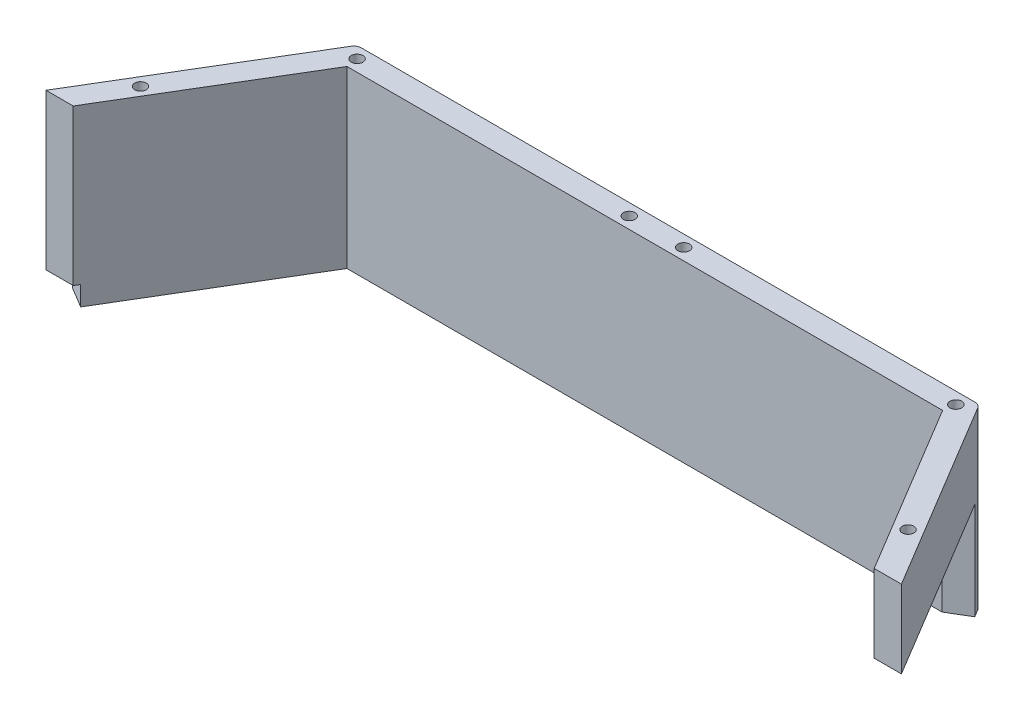
ISO-10303-21;
HEADER;
FILE_DESCRIPTION(('STEP AP214'),'2;1');
FILE_NAME('part.step','',(''),(''),'','','');
FILE_SCHEMA(('AUTOMOTIVE_DESIGN { 1 0 10303 214 1 1 1 1 }'));
ENDSEC;
DATA;
#1=APPLICATION_CONTEXT('core data for automotive mechanical design processes');
#2=APPLICATION_PROTOCOL_DEFINITION('international standard','automotive_design',2000,#1);
#3=PRODUCT_CONTEXT('',#1,'mechanical');
#4=PRODUCT('Part','Part','',(#3));
#5=PRODUCT_RELATED_PRODUCT_CATEGORY('part','',(#4));
#6=PRODUCT_DEFINITION_FORMATION('','',#4);
#7=PRODUCT_DEFINITION_CONTEXT('part definition',#1,'design');
#8=PRODUCT_DEFINITION('design','',#6,#7);
#9=PRODUCT_DEFINITION_SHAPE('','',#8);
#10=(LENGTH_UNIT() NAMED_UNIT(*) SI_UNIT(.MILLI.,.METRE.));
#11=(NAMED_UNIT(*) PLANE_ANGLE_UNIT() SI_UNIT($,.RADIAN.));
#12=(NAMED_UNIT(*) SI_UNIT($,.STERADIAN.) SOLID_ANGLE_UNIT());
#13=UNCERTAINTY_MEASURE_WITH_UNIT(LENGTH_MEASURE(1.E-05),#10,'distance_accuracy_value','');
#14=(GEOMETRIC_REPRESENTATION_CONTEXT(3) GLOBAL_UNCERTAINTY_ASSIGNED_CONTEXT((#13)) GLOBAL_UNIT_ASSIGNED_CONTEXT((#10,
#11,#12)) REPRESENTATION_CONTEXT('',''));
#15=CARTESIAN_POINT('',(0.,0.,0.));
#16=DIRECTION('',(0.,0.,1.));
#17=DIRECTION('',(1.,0.,0.));
#18=AXIS2_PLACEMENT_3D('',#15,#16,#17);
#19=CARTESIAN_POINT('',(-76.6,22.5,-43.9999999999998));
#20=DIRECTION('',(-0.857492925712545,0.,-0.514495755427526));
#21=DIRECTION('',(-0.514495755427526,0.,0.857492925712545));
#22=AXIS2_PLACEMENT_3D('',#19,#20,#21);
#23=PLANE('',#22);
#24=DIRECTION('',(0.,1.,0.));
#25=VECTOR('',#24,1.);
#26=CARTESIAN_POINT('',(-102.280462399333,-17.5,-1.19922933444495));
#27=LINE('',#26,#25);
#28=CARTESIAN_POINT('',(-102.280462399333,-22.5,-1.19922933444495));
#29=VERTEX_POINT('',#28);
#30=CARTESIAN_POINT('',(-102.280462399333,-17.5,-1.19922933444495));
#31=VERTEX_POINT('',#30);
#32=EDGE_CURVE('E140',#29,#31,#27,.T.);
#33=ORIENTED_EDGE('',*,*,#32,.F.);
#34=DIRECTION('',(0.514495755427526,0.,-0.857492925712545));
#35=VECTOR('',#34,1.);
#36=CARTESIAN_POINT('',(-76.6,-22.5,-43.9999999999998));
#37=LINE('',#36,#35);
#38=CARTESIAN_POINT('',(-76.6,-22.5,-43.9999999999998));
#39=VERTEX_POINT('',#38);
#40=EDGE_CURVE('E155',#29,#39,#37,.T.);
#41=ORIENTED_EDGE('',*,*,#40,.T.);
#42=DIRECTION('',(0.,-1.,0.));
#43=VECTOR('',#42,1.);
#44=CARTESIAN_POINT('',(-76.6,22.5,-43.9999999999998));
#45=LINE('',#44,#43);
#46=CARTESIAN_POINT('',(-76.6,22.5,-43.9999999999998));
#47=VERTEX_POINT('',#46);
#48=EDGE_CURVE('E195',#47,#39,#45,.T.);
#49=ORIENTED_EDGE('',*,*,#48,.F.);
#50=DIRECTION('',(0.514495755427526,0.,-0.857492925712545));
#51=VECTOR('',#50,1.);
#52=CARTESIAN_POINT('',(-76.6,22.5,-43.9999999999998));
#53=LINE('',#52,#51);
#54=CARTESIAN_POINT('',(-103.,22.5,1.75709577940571E-13));
#55=VERTEX_POINT('',#54);
#56=EDGE_CURVE('E269',#55,#47,#53,.T.);
#57=ORIENTED_EDGE('',*,*,#56,.F.);
#58=DIRECTION('',(0.,-1.,0.));
#59=VECTOR('',#58,1.);
#60=CARTESIAN_POINT('',(-103.,22.5,1.75709577940571E-13));
#61=LINE('',#60,#59);
#62=CARTESIAN_POINT('',(-103.,-17.5,1.75458324507114E-13));
#63=VERTEX_POINT('',#62);
#64=EDGE_CURVE('E191',#55,#63,#61,.T.);
#65=ORIENTED_EDGE('',*,*,#64,.T.);
#66=DIRECTION('',(-0.514495755427527,0.,0.857492925712544));
#67=VECTOR('',#66,1.);
#68=CARTESIAN_POINT('',(-104.852941176471,-17.5,3.08823529411777));
#69=LINE('',#68,#67);
#70=EDGE_CURVE('E153',#31,#63,#69,.T.);
#71=ORIENTED_EDGE('',*,*,#70,.F.);
#72=EDGE_LOOP('',(#33,#41,#49,#57,#65,#71));
#73=FACE_BOUND('',#72,.T.);
#74=ADVANCED_FACE('F39',(#73),#23,.F.);
#75=CARTESIAN_POINT('',(110.,22.5,1.76566830699974E-13));
#76=DIRECTION('',(-0.857492925712544,0.,0.514495755427526));
#77=DIRECTION('',(0.514495755427526,0.,0.857492925712544));
#78=AXIS2_PLACEMENT_3D('',#75,#76,#77);
#79=PLANE('',#78);
#80=DIRECTION('',(0.,1.,0.));
#81=VECTOR('',#80,1.);
#82=CARTESIAN_POINT('',(81.7027334514861,2.5,-47.1621109141898));
#83=LINE('',#82,#81);
#84=CARTESIAN_POINT('',(81.7027334514861,-22.5,-47.1621109141898));
#85=VERTEX_POINT('',#84);
#86=CARTESIAN_POINT('',(81.7027334514861,2.5,-47.1621109141898));
#87=VERTEX_POINT('',#86);
#88=EDGE_CURVE('E316',#85,#87,#83,.T.);
#89=ORIENTED_EDGE('',*,*,#88,.F.);
#90=DIRECTION('',(-0.514495755427526,0.,-0.857492925712544));
#91=VECTOR('',#90,1.);
#92=CARTESIAN_POINT('',(110.,-22.5,1.76566830699974E-13));
#93=LINE('',#92,#91);
#94=CARTESIAN_POINT('',(80.582605093487,-22.5,-49.0289915108549));
#95=VERTEX_POINT('',#94);
#96=EDGE_CURVE('E165',#85,#95,#93,.T.);
#97=ORIENTED_EDGE('',*,*,#96,.T.);
#98=DIRECTION('',(0.,-1.,0.));
#99=VECTOR('',#98,1.);
#100=CARTESIAN_POINT('',(80.582605093487,22.5,-49.0289915108549));
#101=LINE('',#100,#99);
#102=CARTESIAN_POINT('',(80.582605093487,22.5,-49.0289915108549));
#103=VERTEX_POINT('',#102);
#104=EDGE_CURVE('E207',#95,#103,#101,.F.);
#105=ORIENTED_EDGE('',*,*,#104,.T.);
#106=DIRECTION('',(-0.514495755427526,0.,-0.857492925712544));
#107=VECTOR('',#106,1.);
#108=CARTESIAN_POINT('',(110.,22.5,1.76566830699974E-13));
#109=LINE('',#108,#107);
#110=CARTESIAN_POINT('',(110.,22.5,1.76566830699974E-13));
#111=VERTEX_POINT('',#110);
#112=EDGE_CURVE('E277',#111,#103,#109,.T.);
#113=ORIENTED_EDGE('',*,*,#112,.F.);
#114=DIRECTION('',(0.,-1.,0.));
#115=VECTOR('',#114,1.);
#116=CARTESIAN_POINT('',(110.,22.5,1.76566830699974E-13));
#117=LINE('',#116,#115);
#118=CARTESIAN_POINT('',(110.,2.50000000000001,1.76566830699974E-13));
#119=VERTEX_POINT('',#118);
#120=EDGE_CURVE('E182',#111,#119,#117,.T.);
#121=ORIENTED_EDGE('',*,*,#120,.T.);
#122=DIRECTION('',(0.514495755427527,0.,0.857492925712544));
#123=VECTOR('',#122,1.);
#124=CARTESIAN_POINT('',(110.,2.5,1.73472347597681E-13));
#125=LINE('',#124,#123);
#126=EDGE_CURVE('E65',#87,#119,#125,.T.);
#127=ORIENTED_EDGE('',*,*,#126,.F.);
#128=EDGE_LOOP('',(#89,#97,#105,#113,#121,#127));
#129=FACE_BOUND('',#128,.T.);
#130=ADVANCED_FACE('F327',(#129),#79,.F.);
#131=CARTESIAN_POINT('',(-103.,22.5,1.75709577940571E-13));
#132=DIRECTION('',(0.,0.,-1.));
#133=DIRECTION('',(-1.,0.,0.));
#134=AXIS2_PLACEMENT_3D('',#131,#132,#133);
#135=PLANE('',#134);
#136=DIRECTION('',(0.,-1.,0.));
#137=VECTOR('',#136,1.);
#138=CARTESIAN_POINT('',(-110.,22.5,1.76566830699974E-13));
#139=LINE('',#138,#137);
#140=CARTESIAN_POINT('',(-110.,22.5,1.76566830699974E-13));
#141=VERTEX_POINT('',#140);
#142=CARTESIAN_POINT('',(-110.,-17.5,1.73129347676788E-13));
#143=VERTEX_POINT('',#142);
#144=EDGE_CURVE('E179',#141,#143,#139,.T.);
#145=ORIENTED_EDGE('',*,*,#144,.T.);
#146=DIRECTION('',(1.,0.,0.));
#147=VECTOR('',#146,1.);
#148=CARTESIAN_POINT('',(-103.,-17.5,1.75709577940571E-13));
#149=LINE('',#148,#147);
#150=EDGE_CURVE('E295',#143,#63,#149,.T.);
#151=ORIENTED_EDGE('',*,*,#150,.T.);
#152=ORIENTED_EDGE('',*,*,#64,.F.);
#153=DIRECTION('',(1.,0.,0.));
#154=VECTOR('',#153,1.);
#155=CARTESIAN_POINT('',(-103.,22.5,1.75709577940571E-13));
#156=LINE('',#155,#154);
#157=EDGE_CURVE('E177',#141,#55,#156,.T.);
#158=ORIENTED_EDGE('',*,*,#157,.F.);
#159=EDGE_LOOP('',(#145,#151,#152,#158));
#160=FACE_BOUND('',#159,.T.);
#161=ADVANCED_FACE('F291',(#160),#135,.F.);
#162=CARTESIAN_POINT('',(76.6,22.5,-43.9999999999998));
#163=DIRECTION('',(0.,0.,-1.));
#164=DIRECTION('',(-1.,0.,0.));
#165=AXIS2_PLACEMENT_3D('',#162,#163,#164);
#166=PLANE('',#165);
#167=DIRECTION('',(0.,1.,0.));
#168=VECTOR('',#167,1.);
#169=CARTESIAN_POINT('',(76.4325485945028,22.5,-43.9999999999998));
#170=LINE('',#169,#168);
#171=CARTESIAN_POINT('',(76.4325485945028,-22.5,-43.9999999999998));
#172=VERTEX_POINT('',#171);
#173=CARTESIAN_POINT('',(76.4325485945028,2.5,-43.9999999999998));
#174=VERTEX_POINT('',#173);
#175=EDGE_CURVE('E225',#172,#174,#170,.T.);
#176=ORIENTED_EDGE('',*,*,#175,.T.);
#177=DIRECTION('',(1.,0.,0.));
#178=VECTOR('',#177,1.);
#179=CARTESIAN_POINT('',(76.6,2.5,-43.9999999999998));
#180=LINE('',#179,#178);
#181=CARTESIAN_POINT('',(76.6,2.5,-43.9999999999998));
#182=VERTEX_POINT('',#181);
#183=EDGE_CURVE('E233',#174,#182,#180,.T.);
#184=ORIENTED_EDGE('',*,*,#183,.T.);
#185=DIRECTION('',(0.,-1.,0.));
#186=VECTOR('',#185,1.);
#187=CARTESIAN_POINT('',(76.6,22.5,-43.9999999999998));
#188=LINE('',#187,#186);
#189=CARTESIAN_POINT('',(76.6,22.5,-43.9999999999998));
#190=VERTEX_POINT('',#189);
#191=EDGE_CURVE('E186',#190,#182,#188,.T.);
#192=ORIENTED_EDGE('',*,*,#191,.F.);
#193=DIRECTION('',(1.,0.,0.));
#194=VECTOR('',#193,1.);
#195=CARTESIAN_POINT('',(76.6,22.5,-43.9999999999998));
#196=LINE('',#195,#194);
#197=EDGE_CURVE('E270',#47,#190,#196,.T.);
#198=ORIENTED_EDGE('',*,*,#197,.F.);
#199=ORIENTED_EDGE('',*,*,#48,.T.);
#200=DIRECTION('',(1.,0.,0.));
#201=VECTOR('',#200,1.);
#202=CARTESIAN_POINT('',(76.6,-22.5,-43.9999999999998));
#203=LINE('',#202,#201);
#204=EDGE_CURVE('E163',#39,#172,#203,.T.);
#205=ORIENTED_EDGE('',*,*,#204,.T.);
#206=EDGE_LOOP('',(#176,#184,#192,#198,#199,#205));
#207=FACE_BOUND('',#206,.T.);
#208=ADVANCED_FACE('F297',(#207),#166,.F.);
#209=CARTESIAN_POINT('',(76.6,22.5,-43.9999999999998));
#210=DIRECTION('',(0.857492925712545,0.,-0.514495755427526));
#211=DIRECTION('',(-0.514495755427526,0.,-0.857492925712545));
#212=AXIS2_PLACEMENT_3D('',#209,#210,#211);
#213=PLANE('',#212);
#214=ORIENTED_EDGE('',*,*,#191,.T.);
#215=DIRECTION('',(0.514495755427526,0.,0.857492925712545));
#216=VECTOR('',#215,1.);
#217=CARTESIAN_POINT('',(76.6,2.5,-43.9999999999998));
#218=LINE('',#217,#216);
#219=CARTESIAN_POINT('',(103.,2.5,1.75709577940571E-13));
#220=VERTEX_POINT('',#219);
#221=EDGE_CURVE('E226',#182,#220,#218,.T.);
#222=ORIENTED_EDGE('',*,*,#221,.T.);
#223=DIRECTION('',(0.,-1.,0.));
#224=VECTOR('',#223,1.);
#225=CARTESIAN_POINT('',(103.,22.5,1.75709577940571E-13));
#226=LINE('',#225,#224);
#227=CARTESIAN_POINT('',(103.,22.5,1.75709577940571E-13));
#228=VERTEX_POINT('',#227);
#229=EDGE_CURVE('E187',#228,#220,#226,.T.);
#230=ORIENTED_EDGE('',*,*,#229,.F.);
#231=DIRECTION('',(0.514495755427526,0.,0.857492925712545));
#232=VECTOR('',#231,1.);
#233=CARTESIAN_POINT('',(76.6,22.5,-43.9999999999998));
#234=LINE('',#233,#232);
#235=EDGE_CURVE('E275',#190,#228,#234,.T.);
#236=ORIENTED_EDGE('',*,*,#235,.F.);
#237=EDGE_LOOP('',(#214,#222,#230,#236));
#238=FACE_BOUND('',#237,.T.);
#239=ADVANCED_FACE('F305',(#238),#213,.F.);
#240=CARTESIAN_POINT('',(103.,22.5,1.75709577940571E-13));
#241=DIRECTION('',(0.,0.,-1.));
#242=DIRECTION('',(-1.,0.,0.));
#243=AXIS2_PLACEMENT_3D('',#240,#241,#242);
#244=PLANE('',#243);
#245=ORIENTED_EDGE('',*,*,#229,.T.);
#246=DIRECTION('',(1.,0.,0.));
#247=VECTOR('',#246,1.);
#248=CARTESIAN_POINT('',(103.,2.5,1.75709577940571E-13));
#249=LINE('',#248,#247);
#250=EDGE_CURVE('E149',#220,#119,#249,.T.);
#251=ORIENTED_EDGE('',*,*,#250,.T.);
#252=ORIENTED_EDGE('',*,*,#120,.F.);
#253=DIRECTION('',(1.,0.,0.));
#254=VECTOR('',#253,1.);
#255=CARTESIAN_POINT('',(103.,22.5,1.75709577940571E-13));
#256=LINE('',#255,#254);
#257=EDGE_CURVE('E274',#228,#111,#256,.T.);
#258=ORIENTED_EDGE('',*,*,#257,.F.);
#259=EDGE_LOOP('',(#245,#251,#252,#258));
#260=FACE_BOUND('',#259,.T.);
#261=ADVANCED_FACE('F302',(#260),#244,.F.);
#262=CARTESIAN_POINT('',(-80.,22.5,-49.9999999999998));
#263=DIRECTION('',(0.,0.,1.));
#264=DIRECTION('',(1.,0.,0.));
#265=AXIS2_PLACEMENT_3D('',#262,#263,#264);
#266=PLANE('',#265);
#267=DIRECTION('',(-1.,0.,0.));
#268=VECTOR('',#267,1.);
#269=CARTESIAN_POINT('',(-80.,22.5,-49.9999999999998));
#270=LINE('',#269,#268);
#271=CARTESIAN_POINT('',(78.8676192420619,22.5,-49.9999999999998));
#272=VERTEX_POINT('',#271);
#273=CARTESIAN_POINT('',(-78.8676192420619,22.5,-49.9999999999998));
#274=VERTEX_POINT('',#273);
#275=EDGE_CURVE('E279',#272,#274,#270,.T.);
#276=ORIENTED_EDGE('',*,*,#275,.F.);
#277=DIRECTION('',(0.,-1.,0.));
#278=VECTOR('',#277,1.);
#279=CARTESIAN_POINT('',(78.8676192420619,22.5,-49.9999999999998));
#280=LINE('',#279,#278);
#281=CARTESIAN_POINT('',(78.8676192420619,-22.5,-49.9999999999998));
#282=VERTEX_POINT('',#281);
#283=EDGE_CURVE('E199',#272,#282,#280,.T.);
#284=ORIENTED_EDGE('',*,*,#283,.T.);
#285=DIRECTION('',(-1.,0.,0.));
#286=VECTOR('',#285,1.);
#287=CARTESIAN_POINT('',(-80.,-22.5,-49.9999999999998));
#288=LINE('',#287,#286);
#289=CARTESIAN_POINT('',(-78.8676192420619,-22.5,-49.9999999999998));
#290=VERTEX_POINT('',#289);
#291=EDGE_CURVE('E172',#282,#290,#288,.T.);
#292=ORIENTED_EDGE('',*,*,#291,.T.);
#293=DIRECTION('',(0.,-1.,0.));
#294=VECTOR('',#293,1.);
#295=CARTESIAN_POINT('',(-78.8676192420619,22.5,-49.9999999999998));
#296=LINE('',#295,#294);
#297=EDGE_CURVE('E197',#290,#274,#296,.F.);
#298=ORIENTED_EDGE('',*,*,#297,.T.);
#299=EDGE_LOOP('',(#276,#284,#292,#298));
#300=FACE_BOUND('',#299,.T.);
#301=ADVANCED_FACE('F313',(#300),#266,.F.);
#302=CARTESIAN_POINT('',(-110.,22.5,1.76566830699974E-13));
#303=DIRECTION('',(0.857492925712544,0.,0.514495755427526));
#304=DIRECTION('',(0.514495755427526,0.,-0.857492925712544));
#305=AXIS2_PLACEMENT_3D('',#302,#303,#304);
#306=PLANE('',#305);
#307=DIRECTION('',(0.,1.,0.));
#308=VECTOR('',#307,1.);
#309=CARTESIAN_POINT('',(-107.427521222862,22.5,-4.28746462856255));
#310=LINE('',#309,#308);
#311=CARTESIAN_POINT('',(-107.427521222862,-22.5,-4.28746462856257));
#312=VERTEX_POINT('',#311);
#313=CARTESIAN_POINT('',(-107.427521222862,-17.5,-4.28746462856255));
#314=VERTEX_POINT('',#313);
#315=EDGE_CURVE('E141',#312,#314,#310,.T.);
#316=ORIENTED_EDGE('',*,*,#315,.T.);
#317=DIRECTION('',(-0.514495755427526,0.,0.857492925712544));
#318=VECTOR('',#317,1.);
#319=CARTESIAN_POINT('',(-110.,-17.5,1.76566830699974E-13));
#320=LINE('',#319,#318);
#321=EDGE_CURVE('E11',#314,#143,#320,.T.);
#322=ORIENTED_EDGE('',*,*,#321,.T.);
#323=ORIENTED_EDGE('',*,*,#144,.F.);
#324=DIRECTION('',(-0.514495755427526,0.,0.857492925712544));
#325=VECTOR('',#324,1.);
#326=CARTESIAN_POINT('',(-110.,22.5,1.76566830699974E-13));
#327=LINE('',#326,#325);
#328=CARTESIAN_POINT('',(-80.582605093487,22.5,-49.0289915108549));
#329=VERTEX_POINT('',#328);
#330=EDGE_CURVE('E167',#329,#141,#327,.T.);
#331=ORIENTED_EDGE('',*,*,#330,.F.);
#332=DIRECTION('',(0.,-1.,0.));
#333=VECTOR('',#332,1.);
#334=CARTESIAN_POINT('',(-80.582605093487,22.5,-49.0289915108549));
#335=LINE('',#334,#333);
#336=CARTESIAN_POINT('',(-80.582605093487,-22.5,-49.0289915108549));
#337=VERTEX_POINT('',#336);
#338=EDGE_CURVE('E215',#329,#337,#335,.T.);
#339=ORIENTED_EDGE('',*,*,#338,.T.);
#340=DIRECTION('',(-0.514495755427526,0.,0.857492925712544));
#341=VECTOR('',#340,1.);
#342=CARTESIAN_POINT('',(-110.,-22.5,1.76566830699974E-13));
#343=LINE('',#342,#341);
#344=EDGE_CURVE('E180',#337,#312,#343,.T.);
#345=ORIENTED_EDGE('',*,*,#344,.T.);
#346=EDGE_LOOP('',(#316,#322,#323,#331,#339,#345));
#347=FACE_BOUND('',#346,.T.);
#348=ADVANCED_FACE('F290',(#347),#306,.F.);
#349=CARTESIAN_POINT('',(0.,22.5,0.));
#350=DIRECTION('',(0.,-1.,0.));
#351=DIRECTION('',(0.,0.,-1.));
#352=AXIS2_PLACEMENT_3D('',#349,#350,#351);
#353=PLANE('',#352);
#354=CARTESIAN_POINT('',(-98.7014288630928,22.5,-12.9999999999998));
#355=DIRECTION('',(0.,1.,0.));
#356=DIRECTION('',(0.,0.,1.));
#357=AXIS2_PLACEMENT_3D('',#354,#355,#356);
#358=CIRCLE('',#357,1.5);
#359=CARTESIAN_POINT('',(-98.7014288630928,22.5,-11.4999999999998));
#360=VERTEX_POINT('',#359);
#361=EDGE_CURVE('E170',#360,#360,#358,.T.);
#362=ORIENTED_EDGE('',*,*,#361,.F.);
#363=EDGE_LOOP('',(#362));
#364=FACE_BOUND('',#363,.T.);
#365=CARTESIAN_POINT('',(-77.,22.5,-46.9999999999998));
#366=DIRECTION('',(0.,1.,0.));
#367=DIRECTION('',(0.,0.,1.));
#368=AXIS2_PLACEMENT_3D('',#365,#366,#367);
#369=CIRCLE('',#368,1.5);
#370=CARTESIAN_POINT('',(-77.,22.5,-45.4999999999998));
#371=VERTEX_POINT('',#370);
#372=EDGE_CURVE('E240',#371,#371,#369,.T.);
#373=ORIENTED_EDGE('',*,*,#372,.F.);
#374=EDGE_LOOP('',(#373));
#375=FACE_BOUND('',#374,.T.);
#376=CARTESIAN_POINT('',(-7.00000000000001,22.5,-46.9999999999998));
#377=DIRECTION('',(0.,1.,0.));
#378=DIRECTION('',(0.,0.,1.));
#379=AXIS2_PLACEMENT_3D('',#376,#377,#378);
#380=CIRCLE('',#379,1.5);
#381=CARTESIAN_POINT('',(-7.00000000000001,22.5,-45.4999999999998));
#382=VERTEX_POINT('',#381);
#383=EDGE_CURVE('E243',#382,#382,#380,.T.);
#384=ORIENTED_EDGE('',*,*,#383,.F.);
#385=EDGE_LOOP('',(#384));
#386=FACE_BOUND('',#385,.T.);
#387=CARTESIAN_POINT('',(7.00000000000001,22.5,-46.9999999999998));
#388=DIRECTION('',(0.,1.,0.));
#389=DIRECTION('',(0.,0.,-1.));
#390=AXIS2_PLACEMENT_3D('',#387,#388,#389);
#391=CIRCLE('',#390,1.5);
#392=CARTESIAN_POINT('',(7.00000000000001,22.5,-48.4999999999998));
#393=VERTEX_POINT('',#392);
#394=EDGE_CURVE('E248',#393,#393,#391,.T.);
#395=ORIENTED_EDGE('',*,*,#394,.F.);
#396=EDGE_LOOP('',(#395));
#397=FACE_BOUND('',#396,.T.);
#398=CARTESIAN_POINT('',(77.,22.5,-46.9999999999998));
#399=DIRECTION('',(0.,1.,0.));
#400=DIRECTION('',(0.,0.,-1.));
#401=AXIS2_PLACEMENT_3D('',#398,#399,#400);
#402=CIRCLE('',#401,1.5);
#403=CARTESIAN_POINT('',(77.,22.5,-48.4999999999998));
#404=VERTEX_POINT('',#403);
#405=EDGE_CURVE('E253',#404,#404,#402,.T.);
#406=ORIENTED_EDGE('',*,*,#405,.F.);
#407=EDGE_LOOP('',(#406));
#408=FACE_BOUND('',#407,.T.);
#409=CARTESIAN_POINT('',(98.7014288630928,22.5,-12.9999999999998));
#410=DIRECTION('',(0.,1.,0.));
#411=DIRECTION('',(0.,0.,-1.));
#412=AXIS2_PLACEMENT_3D('',#409,#410,#411);
#413=CIRCLE('',#412,1.5);
#414=CARTESIAN_POINT('',(98.7014288630928,22.5,-14.4999999999998));
#415=VERTEX_POINT('',#414);
#416=EDGE_CURVE('E262',#415,#415,#413,.T.);
#417=ORIENTED_EDGE('',*,*,#416,.F.);
#418=EDGE_LOOP('',(#417));
#419=FACE_BOUND('',#418,.T.);
#420=ORIENTED_EDGE('',*,*,#112,.T.);
#421=CARTESIAN_POINT('',(78.8676192420619,22.5,-47.9999999999998));
#422=DIRECTION('',(0.,-1.,0.));
#423=DIRECTION('',(0.,0.,-1.));
#424=AXIS2_PLACEMENT_3D('',#421,#422,#423);
#425=CIRCLE('',#424,2.);
#426=EDGE_CURVE('E208',#103,#272,#425,.F.);
#427=ORIENTED_EDGE('',*,*,#426,.T.);
#428=ORIENTED_EDGE('',*,*,#275,.T.);
#429=CARTESIAN_POINT('',(-78.8676192420619,22.5,-47.9999999999998));
#430=DIRECTION('',(0.,-1.,0.));
#431=DIRECTION('',(0.,0.,-1.));
#432=AXIS2_PLACEMENT_3D('',#429,#430,#431);
#433=CIRCLE('',#432,2.);
#434=EDGE_CURVE('E206',#274,#329,#433,.F.);
#435=ORIENTED_EDGE('',*,*,#434,.T.);
#436=ORIENTED_EDGE('',*,*,#330,.T.);
#437=ORIENTED_EDGE('',*,*,#157,.T.);
#438=ORIENTED_EDGE('',*,*,#56,.T.);
#439=ORIENTED_EDGE('',*,*,#197,.T.);
#440=ORIENTED_EDGE('',*,*,#235,.T.);
#441=ORIENTED_EDGE('',*,*,#257,.T.);
#442=EDGE_LOOP('',(#420,#427,#428,#435,#436,#437,#438,#439,#440,#441));
#443=FACE_BOUND('',#442,.T.);
#444=ADVANCED_FACE('F283',(#364,#375,#386,#397,#408,#419,#443),#353,.F.);
#445=CARTESIAN_POINT('',(0.,-22.5,0.));
#446=DIRECTION('',(0.,-1.,0.));
#447=DIRECTION('',(0.,0.,-1.));
#448=AXIS2_PLACEMENT_3D('',#445,#446,#447);
#449=PLANE('',#448);
#450=DIRECTION('',(0.857492925712544,0.,0.514495755427526));
#451=VECTOR('',#450,1.);
#452=CARTESIAN_POINT('',(-110.855391656458,-22.5,-6.34418688872021));
#453=LINE('',#452,#451);
#454=EDGE_CURVE('E50',#312,#29,#453,.T.);
#455=ORIENTED_EDGE('',*,*,#454,.F.);
#456=ORIENTED_EDGE('',*,*,#344,.F.);
#457=CARTESIAN_POINT('',(-78.8676192420619,-22.5,-47.9999999999998));
#458=DIRECTION('',(0.,-1.,0.));
#459=DIRECTION('',(0.,0.,-1.));
#460=AXIS2_PLACEMENT_3D('',#457,#458,#459);
#461=CIRCLE('',#460,2.);
#462=EDGE_CURVE('E201',#337,#290,#461,.T.);
#463=ORIENTED_EDGE('',*,*,#462,.T.);
#464=ORIENTED_EDGE('',*,*,#291,.F.);
#465=CARTESIAN_POINT('',(78.8676192420619,-22.5,-47.9999999999998));
#466=DIRECTION('',(0.,-1.,0.));
#467=DIRECTION('',(0.,0.,-1.));
#468=AXIS2_PLACEMENT_3D('',#465,#466,#467);
#469=CIRCLE('',#468,2.);
#470=EDGE_CURVE('E204',#282,#95,#469,.T.);
#471=ORIENTED_EDGE('',*,*,#470,.T.);
#472=ORIENTED_EDGE('',*,*,#96,.F.);
#473=DIRECTION('',(0.857492925712544,0.,-0.514495755427526));
#474=VECTOR('',#473,1.);
#475=CARTESIAN_POINT('',(73.1278041943606,-22.5,-42.0171533599145));
#476=LINE('',#475,#474);
#477=EDGE_CURVE('E211',#172,#85,#476,.T.);
#478=ORIENTED_EDGE('',*,*,#477,.F.);
#479=ORIENTED_EDGE('',*,*,#204,.F.);
#480=ORIENTED_EDGE('',*,*,#40,.F.);
#481=EDGE_LOOP('',(#455,#456,#463,#464,#471,#472,#478,#479,#480));
#482=FACE_BOUND('',#481,.T.);
#483=ADVANCED_FACE('F159',(#482),#449,.T.);
#484=CARTESIAN_POINT('',(98.7014288630928,17.5,-12.9999999999998));
#485=DIRECTION('',(0.,1.,0.));
#486=DIRECTION('',(0.,0.,1.));
#487=AXIS2_PLACEMENT_3D('',#484,#485,#486);
#488=CYLINDRICAL_SURFACE('',#487,1.5);
#489=CARTESIAN_POINT('',(98.7014288630928,17.5,-12.9999999999998));
#490=DIRECTION('',(0.,1.,0.));
#491=DIRECTION('',(0.,0.,-1.));
#492=AXIS2_PLACEMENT_3D('',#489,#490,#491);
#493=CIRCLE('',#492,1.5);
#494=CARTESIAN_POINT('',(98.7014288630928,17.5,-14.4999999999998));
#495=VERTEX_POINT('',#494);
#496=EDGE_CURVE('E231',#495,#495,#493,.T.);
#497=ORIENTED_EDGE('',*,*,#496,.F.);
#498=EDGE_LOOP('',(#497));
#499=FACE_BOUND('',#498,.T.);
#500=ORIENTED_EDGE('',*,*,#416,.T.);
#501=EDGE_LOOP('',(#500));
#502=FACE_BOUND('',#501,.T.);
#503=ADVANCED_FACE('F393',(#499,#502),#488,.F.);
#504=CARTESIAN_POINT('',(98.7014288630928,17.5,-12.9999999999998));
#505=DIRECTION('',(0.,-1.,0.));
#506=DIRECTION('',(0.,0.,-1.));
#507=AXIS2_PLACEMENT_3D('',#504,#505,#506);
#508=PLANE('',#507);
#509=ORIENTED_EDGE('',*,*,#496,.T.);
#510=EDGE_LOOP('',(#509));
#511=FACE_BOUND('',#510,.T.);
#512=ADVANCED_FACE('F388',(#511),#508,.F.);
#513=CARTESIAN_POINT('',(77.,17.5,-46.9999999999998));
#514=DIRECTION('',(0.,1.,0.));
#515=DIRECTION('',(0.,0.,1.));
#516=AXIS2_PLACEMENT_3D('',#513,#514,#515);
#517=CYLINDRICAL_SURFACE('',#516,1.5);
#518=CARTESIAN_POINT('',(77.,17.5,-46.9999999999998));
#519=DIRECTION('',(0.,1.,0.));
#520=DIRECTION('',(0.,0.,-1.));
#521=AXIS2_PLACEMENT_3D('',#518,#519,#520);
#522=CIRCLE('',#521,1.5);
#523=CARTESIAN_POINT('',(77.,17.5,-48.4999999999998));
#524=VERTEX_POINT('',#523);
#525=EDGE_CURVE('E259',#524,#524,#522,.T.);
#526=ORIENTED_EDGE('',*,*,#525,.F.);
#527=EDGE_LOOP('',(#526));
#528=FACE_BOUND('',#527,.T.);
#529=ORIENTED_EDGE('',*,*,#405,.T.);
#530=EDGE_LOOP('',(#529));
#531=FACE_BOUND('',#530,.T.);
#532=ADVANCED_FACE('F390',(#528,#531),#517,.F.);
#533=CARTESIAN_POINT('',(77.,17.5,-46.9999999999998));
#534=DIRECTION('',(0.,-1.,0.));
#535=DIRECTION('',(0.,0.,-1.));
#536=AXIS2_PLACEMENT_3D('',#533,#534,#535);
#537=PLANE('',#536);
#538=ORIENTED_EDGE('',*,*,#525,.T.);
#539=EDGE_LOOP('',(#538));
#540=FACE_BOUND('',#539,.T.);
#541=ADVANCED_FACE('F385',(#540),#537,.F.);
#542=CARTESIAN_POINT('',(7.00000000000001,17.5,-46.9999999999998));
#543=DIRECTION('',(0.,1.,0.));
#544=DIRECTION('',(0.,0.,1.));
#545=AXIS2_PLACEMENT_3D('',#542,#543,#544);
#546=CYLINDRICAL_SURFACE('',#545,1.5);
#547=CARTESIAN_POINT('',(7.00000000000001,17.5,-46.9999999999998));
#548=DIRECTION('',(0.,1.,0.));
#549=DIRECTION('',(0.,0.,-1.));
#550=AXIS2_PLACEMENT_3D('',#547,#548,#549);
#551=CIRCLE('',#550,1.5);
#552=CARTESIAN_POINT('',(7.00000000000001,17.5,-48.4999999999998));
#553=VERTEX_POINT('',#552);
#554=EDGE_CURVE('E255',#553,#553,#551,.T.);
#555=ORIENTED_EDGE('',*,*,#554,.F.);
#556=EDGE_LOOP('',(#555));
#557=FACE_BOUND('',#556,.T.);
#558=ORIENTED_EDGE('',*,*,#394,.T.);
#559=EDGE_LOOP('',(#558));
#560=FACE_BOUND('',#559,.T.);
#561=ADVANCED_FACE('F378',(#557,#560),#546,.F.);
#562=CARTESIAN_POINT('',(7.00000000000001,17.5,-46.9999999999998));
#563=DIRECTION('',(0.,-1.,0.));
#564=DIRECTION('',(0.,0.,-1.));
#565=AXIS2_PLACEMENT_3D('',#562,#563,#564);
#566=PLANE('',#565);
#567=ORIENTED_EDGE('',*,*,#554,.T.);
#568=EDGE_LOOP('',(#567));
#569=FACE_BOUND('',#568,.T.);
#570=ADVANCED_FACE('F372',(#569),#566,.F.);
#571=CARTESIAN_POINT('',(-7.00000000000001,17.5,-46.9999999999998));
#572=DIRECTION('',(0.,1.,0.));
#573=DIRECTION('',(0.,0.,1.));
#574=AXIS2_PLACEMENT_3D('',#571,#572,#573);
#575=CYLINDRICAL_SURFACE('',#574,1.5);
#576=CARTESIAN_POINT('',(-7.00000000000001,17.5,-46.9999999999998));
#577=DIRECTION('',(0.,1.,0.));
#578=DIRECTION('',(0.,0.,1.));
#579=AXIS2_PLACEMENT_3D('',#576,#577,#578);
#580=CIRCLE('',#579,1.5);
#581=CARTESIAN_POINT('',(-7.00000000000001,17.5,-45.4999999999998));
#582=VERTEX_POINT('',#581);
#583=EDGE_CURVE('E246',#582,#582,#580,.T.);
#584=ORIENTED_EDGE('',*,*,#583,.F.);
#585=EDGE_LOOP('',(#584));
#586=FACE_BOUND('',#585,.T.);
#587=ORIENTED_EDGE('',*,*,#383,.T.);
#588=EDGE_LOOP('',(#587));
#589=FACE_BOUND('',#588,.T.);
#590=ADVANCED_FACE('F371',(#586,#589),#575,.F.);
#591=CARTESIAN_POINT('',(-7.00000000000001,17.5,-46.9999999999998));
#592=DIRECTION('',(0.,1.,0.));
#593=DIRECTION('',(0.,0.,1.));
#594=AXIS2_PLACEMENT_3D('',#591,#592,#593);
#595=PLANE('',#594);
#596=ORIENTED_EDGE('',*,*,#583,.T.);
#597=EDGE_LOOP('',(#596));
#598=FACE_BOUND('',#597,.T.);
#599=ADVANCED_FACE('F366',(#598),#595,.T.);
#600=CARTESIAN_POINT('',(-77.,17.5,-46.9999999999998));
#601=DIRECTION('',(0.,1.,0.));
#602=DIRECTION('',(0.,0.,1.));
#603=AXIS2_PLACEMENT_3D('',#600,#601,#602);
#604=CYLINDRICAL_SURFACE('',#603,1.5);
#605=CARTESIAN_POINT('',(-77.,17.5,-46.9999999999998));
#606=DIRECTION('',(0.,1.,0.));
#607=DIRECTION('',(0.,0.,1.));
#608=AXIS2_PLACEMENT_3D('',#605,#606,#607);
#609=CIRCLE('',#608,1.5);
#610=CARTESIAN_POINT('',(-77.,17.5,-45.4999999999998));
#611=VERTEX_POINT('',#610);
#612=EDGE_CURVE('E239',#611,#611,#609,.T.);
#613=ORIENTED_EDGE('',*,*,#612,.F.);
#614=EDGE_LOOP('',(#613));
#615=FACE_BOUND('',#614,.T.);
#616=ORIENTED_EDGE('',*,*,#372,.T.);
#617=EDGE_LOOP('',(#616));
#618=FACE_BOUND('',#617,.T.);
#619=ADVANCED_FACE('F361',(#615,#618),#604,.F.);
#620=CARTESIAN_POINT('',(-77.,17.5,-46.9999999999998));
#621=DIRECTION('',(0.,1.,0.));
#622=DIRECTION('',(0.,0.,1.));
#623=AXIS2_PLACEMENT_3D('',#620,#621,#622);
#624=PLANE('',#623);
#625=ORIENTED_EDGE('',*,*,#612,.T.);
#626=EDGE_LOOP('',(#625));
#627=FACE_BOUND('',#626,.T.);
#628=ADVANCED_FACE('F357',(#627),#624,.T.);
#629=CARTESIAN_POINT('',(-98.7014288630928,17.5,-12.9999999999998));
#630=DIRECTION('',(0.,1.,0.));
#631=DIRECTION('',(0.,0.,1.));
#632=AXIS2_PLACEMENT_3D('',#629,#630,#631);
#633=CYLINDRICAL_SURFACE('',#632,1.5);
#634=CARTESIAN_POINT('',(-98.7014288630928,17.5,-12.9999999999998));
#635=DIRECTION('',(0.,1.,0.));
#636=DIRECTION('',(0.,0.,1.));
#637=AXIS2_PLACEMENT_3D('',#634,#635,#636);
#638=CIRCLE('',#637,1.5);
#639=CARTESIAN_POINT('',(-98.7014288630928,17.5,-11.4999999999998));
#640=VERTEX_POINT('',#639);
#641=EDGE_CURVE('E162',#640,#640,#638,.T.);
#642=ORIENTED_EDGE('',*,*,#641,.F.);
#643=EDGE_LOOP('',(#642));
#644=FACE_BOUND('',#643,.T.);
#645=ORIENTED_EDGE('',*,*,#361,.T.);
#646=EDGE_LOOP('',(#645));
#647=FACE_BOUND('',#646,.T.);
#648=ADVANCED_FACE('F348',(#644,#647),#633,.F.);
#649=CARTESIAN_POINT('',(-98.7014288630928,17.5,-12.9999999999998));
#650=DIRECTION('',(0.,1.,0.));
#651=DIRECTION('',(0.,0.,1.));
#652=AXIS2_PLACEMENT_3D('',#649,#650,#651);
#653=PLANE('',#652);
#654=ORIENTED_EDGE('',*,*,#641,.T.);
#655=EDGE_LOOP('',(#654));
#656=FACE_BOUND('',#655,.T.);
#657=ADVANCED_FACE('F343',(#656),#653,.T.);
#658=CARTESIAN_POINT('',(78.8676192420619,22.5,-47.9999999999998));
#659=DIRECTION('',(0.,-1.,0.));
#660=DIRECTION('',(0.,0.,-1.));
#661=AXIS2_PLACEMENT_3D('',#658,#659,#660);
#662=CYLINDRICAL_SURFACE('',#661,2.);
#663=ORIENTED_EDGE('',*,*,#426,.F.);
#664=ORIENTED_EDGE('',*,*,#104,.F.);
#665=ORIENTED_EDGE('',*,*,#470,.F.);
#666=ORIENTED_EDGE('',*,*,#283,.F.);
#667=EDGE_LOOP('',(#663,#664,#665,#666));
#668=FACE_BOUND('',#667,.T.);
#669=ADVANCED_FACE('F311',(#668),#662,.T.);
#670=CARTESIAN_POINT('',(-78.8676192420619,22.5,-47.9999999999998));
#671=DIRECTION('',(0.,-1.,0.));
#672=DIRECTION('',(0.,0.,-1.));
#673=AXIS2_PLACEMENT_3D('',#670,#671,#672);
#674=CYLINDRICAL_SURFACE('',#673,2.);
#675=ORIENTED_EDGE('',*,*,#434,.F.);
#676=ORIENTED_EDGE('',*,*,#297,.F.);
#677=ORIENTED_EDGE('',*,*,#462,.F.);
#678=ORIENTED_EDGE('',*,*,#338,.F.);
#679=EDGE_LOOP('',(#675,#676,#677,#678));
#680=FACE_BOUND('',#679,.T.);
#681=ADVANCED_FACE('F41',(#680),#674,.T.);
#682=CARTESIAN_POINT('',(101.425070742875,2.5,5.14495755427544));
#683=DIRECTION('',(0.,1.,0.));
#684=DIRECTION('',(0.,0.,1.));
#685=AXIS2_PLACEMENT_3D('',#682,#683,#684);
#686=PLANE('',#685);
#687=DIRECTION('',(0.857492925712544,0.,-0.514495755427526));
#688=VECTOR('',#687,1.);
#689=CARTESIAN_POINT('',(73.1278041943606,2.5,-42.0171533599145));
#690=LINE('',#689,#688);
#691=EDGE_CURVE('E224',#174,#87,#690,.T.);
#692=ORIENTED_EDGE('',*,*,#691,.T.);
#693=ORIENTED_EDGE('',*,*,#126,.T.);
#694=ORIENTED_EDGE('',*,*,#250,.F.);
#695=ORIENTED_EDGE('',*,*,#221,.F.);
#696=ORIENTED_EDGE('',*,*,#183,.F.);
#697=EDGE_LOOP('',(#692,#693,#694,#695,#696));
#698=FACE_BOUND('',#697,.T.);
#699=ADVANCED_FACE('F321',(#698),#686,.F.);
#700=CARTESIAN_POINT('',(73.1278041943606,2.5,-42.0171533599145));
#701=DIRECTION('',(-0.514495755427526,0.,-0.857492925712544));
#702=DIRECTION('',(-0.857492925712544,0.,0.514495755427526));
#703=AXIS2_PLACEMENT_3D('',#700,#701,#702);
#704=PLANE('',#703);
#705=ORIENTED_EDGE('',*,*,#477,.T.);
#706=ORIENTED_EDGE('',*,*,#88,.T.);
#707=ORIENTED_EDGE('',*,*,#691,.F.);
#708=ORIENTED_EDGE('',*,*,#175,.F.);
#709=EDGE_LOOP('',(#705,#706,#707,#708));
#710=FACE_BOUND('',#709,.T.);
#711=ADVANCED_FACE('F323',(#710),#704,.F.);
#712=CARTESIAN_POINT('',(-113.427870433596,-17.5,-2.05672226015749));
#713=DIRECTION('',(0.,1.,0.));
#714=DIRECTION('',(0.,0.,1.));
#715=AXIS2_PLACEMENT_3D('',#712,#713,#714);
#716=PLANE('',#715);
#717=ORIENTED_EDGE('',*,*,#321,.F.);
#718=DIRECTION('',(0.857492925712544,0.,0.514495755427526));
#719=VECTOR('',#718,1.);
#720=CARTESIAN_POINT('',(-110.855391656458,-17.5,-6.34418688872021));
#721=LINE('',#720,#719);
#722=EDGE_CURVE('E53',#314,#31,#721,.T.);
#723=ORIENTED_EDGE('',*,*,#722,.T.);
#724=ORIENTED_EDGE('',*,*,#70,.T.);
#725=ORIENTED_EDGE('',*,*,#150,.F.);
#726=EDGE_LOOP('',(#717,#723,#724,#725));
#727=FACE_BOUND('',#726,.T.);
#728=ADVANCED_FACE('F527',(#727),#716,.F.);
#729=CARTESIAN_POINT('',(-110.855391656458,-17.5,-6.34418688872021));
#730=DIRECTION('',(0.514495755427526,0.,-0.857492925712544));
#731=DIRECTION('',(-0.857492925712545,0.,-0.514495755427526));
#732=AXIS2_PLACEMENT_3D('',#729,#730,#731);
#733=PLANE('',#732);
#734=ORIENTED_EDGE('',*,*,#454,.T.);
#735=ORIENTED_EDGE('',*,*,#32,.T.);
#736=ORIENTED_EDGE('',*,*,#722,.F.);
#737=ORIENTED_EDGE('',*,*,#315,.F.);
#738=EDGE_LOOP('',(#734,#735,#736,#737));
#739=FACE_BOUND('',#738,.T.);
#740=ADVANCED_FACE('F138',(#739),#733,.F.);
#741=CLOSED_SHELL('',(#74,#130,#161,#208,#239,#261,#301,#348,#444,#483,#503,#512,#532,#541,#561,
#570,#590,#599,#619,#628,#648,#657,#669,#681,#699,#711,#728,#740));
#742=MANIFOLD_SOLID_BREP('B2',#741);
#743=ADVANCED_BREP_SHAPE_REPRESENTATION('',(#18,#742),#14);
#744=SHAPE_DEFINITION_REPRESENTATION(#9,#743);
ENDSEC;
END-ISO-10303-21;
